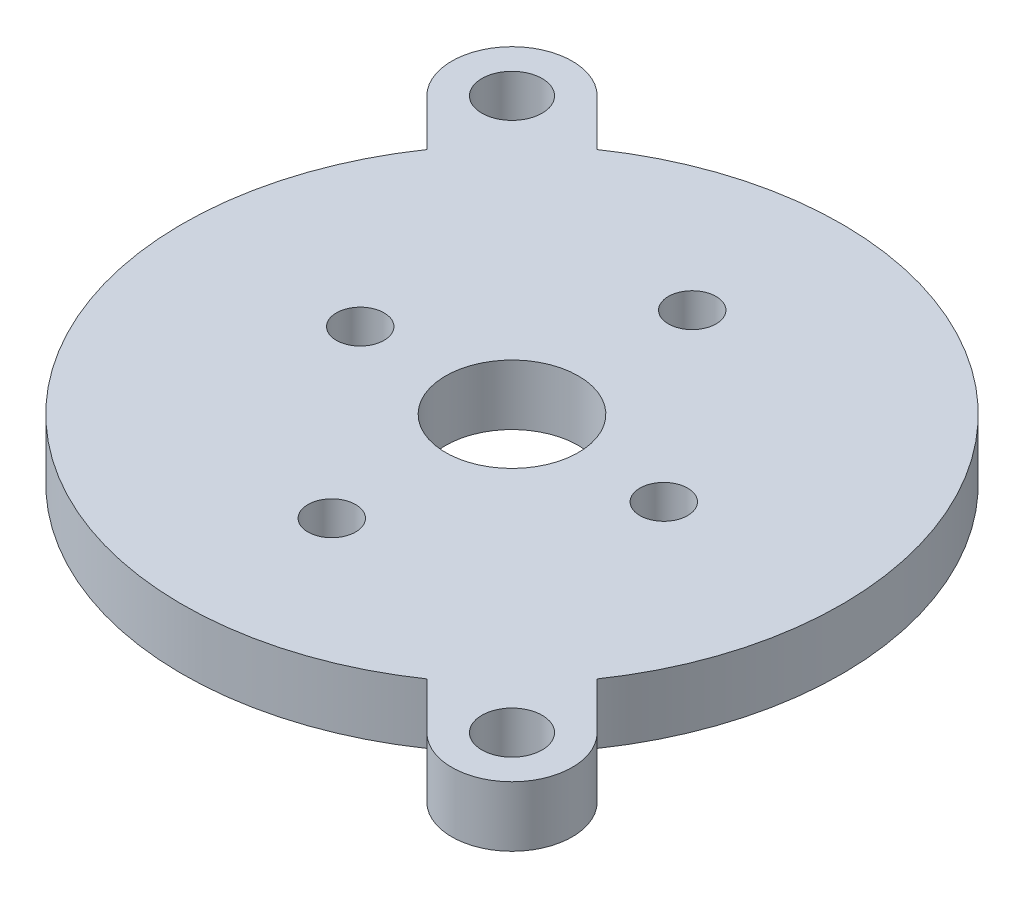
ISO-10303-21;
HEADER;
FILE_DESCRIPTION(('STEP AP214'),'2;1');
FILE_NAME('part.step','',(''),(''),'','','');
FILE_SCHEMA(('AUTOMOTIVE_DESIGN { 1 0 10303 214 1 1 1 1 }'));
ENDSEC;
DATA;
#1=APPLICATION_CONTEXT('core data for automotive mechanical design processes');
#2=APPLICATION_PROTOCOL_DEFINITION('international standard','automotive_design',2000,#1);
#3=PRODUCT_CONTEXT('',#1,'mechanical');
#4=PRODUCT('Part','Part','',(#3));
#5=PRODUCT_RELATED_PRODUCT_CATEGORY('part','',(#4));
#6=PRODUCT_DEFINITION_FORMATION('','',#4);
#7=PRODUCT_DEFINITION_CONTEXT('part definition',#1,'design');
#8=PRODUCT_DEFINITION('design','',#6,#7);
#9=PRODUCT_DEFINITION_SHAPE('','',#8);
#10=(LENGTH_UNIT() NAMED_UNIT(*) SI_UNIT(.MILLI.,.METRE.));
#11=(NAMED_UNIT(*) PLANE_ANGLE_UNIT() SI_UNIT($,.RADIAN.));
#12=(NAMED_UNIT(*) SI_UNIT($,.STERADIAN.) SOLID_ANGLE_UNIT());
#13=UNCERTAINTY_MEASURE_WITH_UNIT(LENGTH_MEASURE(1.E-05),#10,'distance_accuracy_value','');
#14=(GEOMETRIC_REPRESENTATION_CONTEXT(3) GLOBAL_UNCERTAINTY_ASSIGNED_CONTEXT((#13)) GLOBAL_UNIT_ASSIGNED_CONTEXT((#10,
#11,#12)) REPRESENTATION_CONTEXT('',''));
#15=CARTESIAN_POINT('',(0.,0.,0.));
#16=DIRECTION('',(0.,0.,1.));
#17=DIRECTION('',(1.,0.,0.));
#18=AXIS2_PLACEMENT_3D('',#15,#16,#17);
#19=CARTESIAN_POINT('',(0.,0.,0.));
#20=DIRECTION('',(0.,-1.,0.));
#21=DIRECTION('',(0.,0.,-1.));
#22=AXIS2_PLACEMENT_3D('',#19,#20,#21);
#23=CYLINDRICAL_SURFACE('',#22,17.3789975);
#24=DIRECTION('',(0.,-1.,0.));
#25=VECTOR('',#24,1.);
#26=CARTESIAN_POINT('',(14.3270532933242,3.175,9.83692523277755));
#27=LINE('',#26,#25);
#28=CARTESIAN_POINT('',(14.3270532933242,3.175,9.83692523277755));
#29=VERTEX_POINT('',#28);
#30=CARTESIAN_POINT('',(14.3270532933242,0.,9.83692523277755));
#31=VERTEX_POINT('',#30);
#32=EDGE_CURVE('E107',#29,#31,#27,.T.);
#33=ORIENTED_EDGE('',*,*,#32,.T.);
#34=CARTESIAN_POINT('',(0.,0.,0.));
#35=DIRECTION('',(0.,-1.,0.));
#36=DIRECTION('',(0.,0.,-1.));
#37=AXIS2_PLACEMENT_3D('',#34,#35,#36);
#38=CIRCLE('',#37,17.3789975);
#39=CARTESIAN_POINT('',(-9.83692523278474,0.,-14.3270532933192));
#40=VERTEX_POINT('',#39);
#41=EDGE_CURVE('E186',#40,#31,#38,.T.);
#42=ORIENTED_EDGE('',*,*,#41,.F.);
#43=DIRECTION('',(0.,-1.,0.));
#44=VECTOR('',#43,1.);
#45=CARTESIAN_POINT('',(-9.83692523278474,3.175,-14.3270532933192));
#46=LINE('',#45,#44);
#47=CARTESIAN_POINT('',(-9.83692523278474,3.175,-14.3270532933192));
#48=VERTEX_POINT('',#47);
#49=EDGE_CURVE('E156',#48,#40,#46,.T.);
#50=ORIENTED_EDGE('',*,*,#49,.F.);
#51=CARTESIAN_POINT('',(0.,3.175,0.));
#52=DIRECTION('',(0.,-1.,0.));
#53=DIRECTION('',(0.,0.,-1.));
#54=AXIS2_PLACEMENT_3D('',#51,#52,#53);
#55=CIRCLE('',#54,17.3789975);
#56=EDGE_CURVE('E183',#48,#29,#55,.T.);
#57=ORIENTED_EDGE('',*,*,#56,.T.);
#58=EDGE_LOOP('',(#33,#42,#50,#57));
#59=FACE_BOUND('',#58,.T.);
#60=ADVANCED_FACE('F34',(#59),#23,.T.);
#61=CARTESIAN_POINT('',(9.83692523279593,0.,14.3270532933115));
#62=VERTEX_POINT('',#61);
#63=CARTESIAN_POINT('',(-14.3270532933104,0.,-9.83692523279752));
#64=VERTEX_POINT('',#63);
#65=EDGE_CURVE('E185',#62,#64,#38,.T.);
#66=ORIENTED_EDGE('',*,*,#65,.F.);
#67=DIRECTION('',(0.,-1.,0.));
#68=VECTOR('',#67,1.);
#69=CARTESIAN_POINT('',(9.83692523279593,3.175,14.3270532933115));
#70=LINE('',#69,#68);
#71=CARTESIAN_POINT('',(9.83692523279593,3.175,14.3270532933115));
#72=VERTEX_POINT('',#71);
#73=EDGE_CURVE('E126',#72,#62,#70,.T.);
#74=ORIENTED_EDGE('',*,*,#73,.F.);
#75=CARTESIAN_POINT('',(-14.3270532933104,3.175,-9.83692523279752));
#76=VERTEX_POINT('',#75);
#77=EDGE_CURVE('E180',#72,#76,#55,.T.);
#78=ORIENTED_EDGE('',*,*,#77,.T.);
#79=DIRECTION('',(0.,-1.,0.));
#80=VECTOR('',#79,1.);
#81=CARTESIAN_POINT('',(-14.3270532933104,3.175,-9.83692523279752));
#82=LINE('',#81,#80);
#83=EDGE_CURVE('E140',#76,#64,#82,.T.);
#84=ORIENTED_EDGE('',*,*,#83,.T.);
#85=EDGE_LOOP('',(#66,#74,#78,#84));
#86=FACE_BOUND('',#85,.T.);
#87=ADVANCED_FACE('F218',(#86),#23,.T.);
#88=CARTESIAN_POINT('',(0.,3.175,0.));
#89=DIRECTION('',(0.,-1.,0.));
#90=DIRECTION('',(0.,0.,-1.));
#91=AXIS2_PLACEMENT_3D('',#88,#89,#90);
#92=PLANE('',#91);
#93=CARTESIAN_POINT('',(0.,3.175,-9.5));
#94=DIRECTION('',(0.,1.,0.));
#95=DIRECTION('',(0.,0.,1.));
#96=AXIS2_PLACEMENT_3D('',#93,#94,#95);
#97=CIRCLE('',#96,1.2573);
#98=CARTESIAN_POINT('',(0.,3.175,-8.2427));
#99=VERTEX_POINT('',#98);
#100=EDGE_CURVE('E163',#99,#99,#97,.T.);
#101=ORIENTED_EDGE('',*,*,#100,.F.);
#102=EDGE_LOOP('',(#101));
#103=FACE_BOUND('',#102,.T.);
#104=CARTESIAN_POINT('',(0.,3.175,9.5));
#105=DIRECTION('',(0.,1.,0.));
#106=DIRECTION('',(0.,0.,1.));
#107=AXIS2_PLACEMENT_3D('',#104,#105,#106);
#108=CIRCLE('',#107,1.2573);
#109=CARTESIAN_POINT('',(0.,3.175,10.7573));
#110=VERTEX_POINT('',#109);
#111=EDGE_CURVE('E169',#110,#110,#108,.T.);
#112=ORIENTED_EDGE('',*,*,#111,.F.);
#113=EDGE_LOOP('',(#112));
#114=FACE_BOUND('',#113,.T.);
#115=CARTESIAN_POINT('',(8.000000002,3.175,0.));
#116=DIRECTION('',(0.,1.,0.));
#117=DIRECTION('',(0.,0.,1.));
#118=AXIS2_PLACEMENT_3D('',#115,#116,#117);
#119=CIRCLE('',#118,1.2573);
#120=CARTESIAN_POINT('',(8.000000002,3.175,1.2573));
#121=VERTEX_POINT('',#120);
#122=EDGE_CURVE('E158',#121,#121,#119,.T.);
#123=ORIENTED_EDGE('',*,*,#122,.F.);
#124=EDGE_LOOP('',(#123));
#125=FACE_BOUND('',#124,.T.);
#126=CARTESIAN_POINT('',(-8.000000002,3.175,0.));
#127=DIRECTION('',(0.,1.,0.));
#128=DIRECTION('',(0.,0.,1.));
#129=AXIS2_PLACEMENT_3D('',#126,#127,#128);
#130=CIRCLE('',#129,1.2573);
#131=CARTESIAN_POINT('',(-8.000000002,3.175,1.2573));
#132=VERTEX_POINT('',#131);
#133=EDGE_CURVE('E162',#132,#132,#130,.T.);
#134=ORIENTED_EDGE('',*,*,#133,.F.);
#135=EDGE_LOOP('',(#134));
#136=FACE_BOUND('',#135,.T.);
#137=ORIENTED_EDGE('',*,*,#56,.F.);
#138=DIRECTION('',(-0.707106781186796,0.,-0.707106781186299));
#139=VECTOR('',#138,1.);
#140=CARTESIAN_POINT('',(2.24506403027069,3.175,-2.24506403027226));
#141=LINE('',#140,#139);
#142=CARTESIAN_POINT('',(-12.2888069824842,3.175,-16.7789350429985));
#143=VERTEX_POINT('',#142);
#144=EDGE_CURVE('E130',#48,#143,#141,.T.);
#145=ORIENTED_EDGE('',*,*,#144,.T.);
#146=CARTESIAN_POINT('',(-14.5338710127414,3.175,-14.5338710127413));
#147=DIRECTION('',(0.,1.,0.));
#148=DIRECTION('',(0.,0.,1.));
#149=AXIS2_PLACEMENT_3D('',#146,#147,#148);
#150=CIRCLE('',#149,3.17499999997279);
#151=CARTESIAN_POINT('',(-16.7789350429936,3.175,-12.288806982489));
#152=VERTEX_POINT('',#151);
#153=EDGE_CURVE('E132',#143,#152,#150,.T.);
#154=ORIENTED_EDGE('',*,*,#153,.T.);
#155=DIRECTION('',(-0.707106781186552,0.,-0.707106781186543));
#156=VECTOR('',#155,1.);
#157=CARTESIAN_POINT('',(-2.24506403025638,3.175,2.2450640302564));
#158=LINE('',#157,#156);
#159=EDGE_CURVE('E135',#76,#152,#158,.T.);
#160=ORIENTED_EDGE('',*,*,#159,.F.);
#161=ORIENTED_EDGE('',*,*,#77,.F.);
#162=DIRECTION('',(-0.707106781186974,0.,-0.707106781186121));
#163=VECTOR('',#162,1.);
#164=CARTESIAN_POINT('',(-2.24506403026373,3.175,2.24506403026644));
#165=LINE('',#164,#163);
#166=CARTESIAN_POINT('',(12.2888069824804,3.175,16.7789350429989));
#167=VERTEX_POINT('',#166);
#168=EDGE_CURVE('E111',#167,#72,#165,.T.);
#169=ORIENTED_EDGE('',*,*,#168,.F.);
#170=CARTESIAN_POINT('',(14.5338710127414,3.175,14.5338710127413));
#171=DIRECTION('',(0.,1.,0.));
#172=DIRECTION('',(0.,0.,1.));
#173=AXIS2_PLACEMENT_3D('',#170,#171,#172);
#174=CIRCLE('',#173,3.17499999999288);
#175=CARTESIAN_POINT('',(16.7789350430107,3.175,12.2888069824717));
#176=VERTEX_POINT('',#175);
#177=EDGE_CURVE('E112',#167,#176,#174,.T.);
#178=ORIENTED_EDGE('',*,*,#177,.T.);
#179=DIRECTION('',(-0.707106781187493,0.,-0.707106781185602));
#180=VECTOR('',#179,1.);
#181=CARTESIAN_POINT('',(2.24506403025415,3.175,-2.24506403026015));
#182=LINE('',#181,#180);
#183=EDGE_CURVE('E100',#176,#29,#182,.T.);
#184=ORIENTED_EDGE('',*,*,#183,.T.);
#185=EDGE_LOOP('',(#137,#145,#154,#160,#161,#169,#178,#184));
#186=FACE_BOUND('',#185,.T.);
#187=CARTESIAN_POINT('',(0.,3.175,0.));
#188=DIRECTION('',(0.,-1.,0.));
#189=DIRECTION('',(0.,0.,-1.));
#190=AXIS2_PLACEMENT_3D('',#187,#188,#189);
#191=CIRCLE('',#190,3.5);
#192=CARTESIAN_POINT('',(0.,3.175,-3.5));
#193=VERTEX_POINT('',#192);
#194=EDGE_CURVE('E11',#193,#193,#191,.T.);
#195=ORIENTED_EDGE('',*,*,#194,.T.);
#196=EDGE_LOOP('',(#195));
#197=FACE_BOUND('',#196,.T.);
#198=CARTESIAN_POINT('',(-14.5338710127414,3.175,-14.5338710127413));
#199=DIRECTION('',(0.,1.,0.));
#200=DIRECTION('',(0.,0.,1.));
#201=AXIS2_PLACEMENT_3D('',#198,#199,#200);
#202=CIRCLE('',#201,1.5875);
#203=CARTESIAN_POINT('',(-14.5338710127414,3.175,-12.9463710127413));
#204=VERTEX_POINT('',#203);
#205=EDGE_CURVE('E138',#204,#204,#202,.T.);
#206=ORIENTED_EDGE('',*,*,#205,.F.);
#207=EDGE_LOOP('',(#206));
#208=FACE_BOUND('',#207,.T.);
#209=CARTESIAN_POINT('',(14.5338710127414,3.175,14.5338710127413));
#210=DIRECTION('',(0.,1.,0.));
#211=DIRECTION('',(0.,0.,1.));
#212=AXIS2_PLACEMENT_3D('',#209,#210,#211);
#213=CIRCLE('',#212,1.5875);
#214=CARTESIAN_POINT('',(14.5338710127414,3.175,16.1213710127413));
#215=VERTEX_POINT('',#214);
#216=EDGE_CURVE('E119',#215,#215,#213,.T.);
#217=ORIENTED_EDGE('',*,*,#216,.F.);
#218=EDGE_LOOP('',(#217));
#219=FACE_BOUND('',#218,.T.);
#220=ADVANCED_FACE('F36',(#103,#114,#125,#136,#186,#197,#208,#219),#92,.F.);
#221=CARTESIAN_POINT('',(0.,0.,0.));
#222=DIRECTION('',(0.,-1.,0.));
#223=DIRECTION('',(0.,0.,-1.));
#224=AXIS2_PLACEMENT_3D('',#221,#222,#223);
#225=CYLINDRICAL_SURFACE('',#224,3.5);
#226=ORIENTED_EDGE('',*,*,#194,.F.);
#227=EDGE_LOOP('',(#226));
#228=FACE_BOUND('',#227,.T.);
#229=CARTESIAN_POINT('',(0.,0.,0.));
#230=DIRECTION('',(0.,-1.,0.));
#231=DIRECTION('',(0.,0.,-1.));
#232=AXIS2_PLACEMENT_3D('',#229,#230,#231);
#233=CIRCLE('',#232,3.5);
#234=CARTESIAN_POINT('',(0.,0.,-3.5));
#235=VERTEX_POINT('',#234);
#236=EDGE_CURVE('E42',#235,#235,#233,.T.);
#237=ORIENTED_EDGE('',*,*,#236,.T.);
#238=EDGE_LOOP('',(#237));
#239=FACE_BOUND('',#238,.T.);
#240=ADVANCED_FACE('F190',(#228,#239),#225,.F.);
#241=CARTESIAN_POINT('',(0.,0.,0.));
#242=DIRECTION('',(0.,1.,0.));
#243=DIRECTION('',(0.,0.,1.));
#244=AXIS2_PLACEMENT_3D('',#241,#242,#243);
#245=PLANE('',#244);
#246=CARTESIAN_POINT('',(0.,0.,-9.5));
#247=DIRECTION('',(0.,1.,0.));
#248=DIRECTION('',(0.,0.,1.));
#249=AXIS2_PLACEMENT_3D('',#246,#247,#248);
#250=CIRCLE('',#249,1.2573);
#251=CARTESIAN_POINT('',(0.,0.,-8.2427));
#252=VERTEX_POINT('',#251);
#253=EDGE_CURVE('E159',#252,#252,#250,.T.);
#254=ORIENTED_EDGE('',*,*,#253,.T.);
#255=EDGE_LOOP('',(#254));
#256=FACE_BOUND('',#255,.T.);
#257=CARTESIAN_POINT('',(0.,0.,9.5));
#258=DIRECTION('',(0.,1.,0.));
#259=DIRECTION('',(0.,0.,1.));
#260=AXIS2_PLACEMENT_3D('',#257,#258,#259);
#261=CIRCLE('',#260,1.2573);
#262=CARTESIAN_POINT('',(0.,0.,10.7573));
#263=VERTEX_POINT('',#262);
#264=EDGE_CURVE('E166',#263,#263,#261,.T.);
#265=ORIENTED_EDGE('',*,*,#264,.T.);
#266=EDGE_LOOP('',(#265));
#267=FACE_BOUND('',#266,.T.);
#268=CARTESIAN_POINT('',(8.000000002,0.,0.));
#269=DIRECTION('',(0.,1.,0.));
#270=DIRECTION('',(0.,0.,1.));
#271=AXIS2_PLACEMENT_3D('',#268,#269,#270);
#272=CIRCLE('',#271,1.2573);
#273=CARTESIAN_POINT('',(8.000000002,0.,1.2573));
#274=VERTEX_POINT('',#273);
#275=EDGE_CURVE('E172',#274,#274,#272,.T.);
#276=ORIENTED_EDGE('',*,*,#275,.T.);
#277=EDGE_LOOP('',(#276));
#278=FACE_BOUND('',#277,.T.);
#279=CARTESIAN_POINT('',(-8.000000002,0.,0.));
#280=DIRECTION('',(0.,1.,0.));
#281=DIRECTION('',(0.,0.,1.));
#282=AXIS2_PLACEMENT_3D('',#279,#280,#281);
#283=CIRCLE('',#282,1.2573);
#284=CARTESIAN_POINT('',(-8.000000002,0.,1.2573));
#285=VERTEX_POINT('',#284);
#286=EDGE_CURVE('E177',#285,#285,#283,.T.);
#287=ORIENTED_EDGE('',*,*,#286,.T.);
#288=EDGE_LOOP('',(#287));
#289=FACE_BOUND('',#288,.T.);
#290=ORIENTED_EDGE('',*,*,#236,.F.);
#291=EDGE_LOOP('',(#290));
#292=FACE_BOUND('',#291,.T.);
#293=ORIENTED_EDGE('',*,*,#41,.T.);
#294=DIRECTION('',(-0.707106781187493,0.,-0.707106781185602));
#295=VECTOR('',#294,1.);
#296=CARTESIAN_POINT('',(2.24506403025415,0.,-2.24506403026015));
#297=LINE('',#296,#295);
#298=CARTESIAN_POINT('',(16.7789350430107,0.,12.2888069824717));
#299=VERTEX_POINT('',#298);
#300=EDGE_CURVE('E206',#299,#31,#297,.T.);
#301=ORIENTED_EDGE('',*,*,#300,.F.);
#302=CARTESIAN_POINT('',(14.5338710127414,0.,14.5338710127413));
#303=DIRECTION('',(0.,1.,0.));
#304=DIRECTION('',(0.,0.,1.));
#305=AXIS2_PLACEMENT_3D('',#302,#303,#304);
#306=CIRCLE('',#305,3.17499999999288);
#307=CARTESIAN_POINT('',(12.2888069824804,0.,16.7789350429989));
#308=VERTEX_POINT('',#307);
#309=EDGE_CURVE('E122',#308,#299,#306,.T.);
#310=ORIENTED_EDGE('',*,*,#309,.F.);
#311=DIRECTION('',(-0.707106781186974,0.,-0.707106781186121));
#312=VECTOR('',#311,1.);
#313=CARTESIAN_POINT('',(-2.24506403026373,0.,2.24506403026644));
#314=LINE('',#313,#312);
#315=EDGE_CURVE('E49',#308,#62,#314,.T.);
#316=ORIENTED_EDGE('',*,*,#315,.T.);
#317=ORIENTED_EDGE('',*,*,#65,.T.);
#318=DIRECTION('',(-0.707106781186552,0.,-0.707106781186543));
#319=VECTOR('',#318,1.);
#320=CARTESIAN_POINT('',(-2.24506403025638,0.,2.2450640302564));
#321=LINE('',#320,#319);
#322=CARTESIAN_POINT('',(-16.7789350429936,0.,-12.288806982489));
#323=VERTEX_POINT('',#322);
#324=EDGE_CURVE('E144',#64,#323,#321,.T.);
#325=ORIENTED_EDGE('',*,*,#324,.T.);
#326=CARTESIAN_POINT('',(-14.5338710127414,0.,-14.5338710127413));
#327=DIRECTION('',(0.,1.,0.));
#328=DIRECTION('',(0.,0.,1.));
#329=AXIS2_PLACEMENT_3D('',#326,#327,#328);
#330=CIRCLE('',#329,3.17499999997279);
#331=CARTESIAN_POINT('',(-12.2888069824842,0.,-16.7789350429985));
#332=VERTEX_POINT('',#331);
#333=EDGE_CURVE('E124',#332,#323,#330,.T.);
#334=ORIENTED_EDGE('',*,*,#333,.F.);
#335=DIRECTION('',(-0.707106781186796,0.,-0.707106781186299));
#336=VECTOR('',#335,1.);
#337=CARTESIAN_POINT('',(2.24506403027069,0.,-2.24506403027226));
#338=LINE('',#337,#336);
#339=EDGE_CURVE('E56',#40,#332,#338,.T.);
#340=ORIENTED_EDGE('',*,*,#339,.F.);
#341=EDGE_LOOP('',(#293,#301,#310,#316,#317,#325,#334,#340));
#342=FACE_BOUND('',#341,.T.);
#343=CARTESIAN_POINT('',(-14.5338710127414,0.,-14.5338710127413));
#344=DIRECTION('',(0.,1.,0.));
#345=DIRECTION('',(0.,0.,1.));
#346=AXIS2_PLACEMENT_3D('',#343,#344,#345);
#347=CIRCLE('',#346,1.5875);
#348=CARTESIAN_POINT('',(-14.5338710127414,0.,-12.9463710127413));
#349=VERTEX_POINT('',#348);
#350=EDGE_CURVE('E133',#349,#349,#347,.T.);
#351=ORIENTED_EDGE('',*,*,#350,.T.);
#352=EDGE_LOOP('',(#351));
#353=FACE_BOUND('',#352,.T.);
#354=CARTESIAN_POINT('',(14.5338710127414,0.,14.5338710127413));
#355=DIRECTION('',(0.,1.,0.));
#356=DIRECTION('',(0.,0.,1.));
#357=AXIS2_PLACEMENT_3D('',#354,#355,#356);
#358=CIRCLE('',#357,1.5875);
#359=CARTESIAN_POINT('',(14.5338710127414,0.,16.1213710127413));
#360=VERTEX_POINT('',#359);
#361=EDGE_CURVE('E203',#360,#360,#358,.T.);
#362=ORIENTED_EDGE('',*,*,#361,.T.);
#363=EDGE_LOOP('',(#362));
#364=FACE_BOUND('',#363,.T.);
#365=ADVANCED_FACE('F192',(#256,#267,#278,#289,#292,#342,#353,#364),#245,.F.);
#366=CARTESIAN_POINT('',(-8.000000002,0.,0.));
#367=DIRECTION('',(0.,1.,0.));
#368=DIRECTION('',(0.,0.,1.));
#369=AXIS2_PLACEMENT_3D('',#366,#367,#368);
#370=CYLINDRICAL_SURFACE('',#369,1.2573);
#371=ORIENTED_EDGE('',*,*,#286,.F.);
#372=EDGE_LOOP('',(#371));
#373=FACE_BOUND('',#372,.T.);
#374=ORIENTED_EDGE('',*,*,#133,.T.);
#375=EDGE_LOOP('',(#374));
#376=FACE_BOUND('',#375,.T.);
#377=ADVANCED_FACE('F194',(#373,#376),#370,.F.);
#378=CARTESIAN_POINT('',(8.000000002,0.,0.));
#379=DIRECTION('',(0.,1.,0.));
#380=DIRECTION('',(0.,0.,1.));
#381=AXIS2_PLACEMENT_3D('',#378,#379,#380);
#382=CYLINDRICAL_SURFACE('',#381,1.2573);
#383=ORIENTED_EDGE('',*,*,#275,.F.);
#384=EDGE_LOOP('',(#383));
#385=FACE_BOUND('',#384,.T.);
#386=ORIENTED_EDGE('',*,*,#122,.T.);
#387=EDGE_LOOP('',(#386));
#388=FACE_BOUND('',#387,.T.);
#389=ADVANCED_FACE('F281',(#385,#388),#382,.F.);
#390=CARTESIAN_POINT('',(0.,0.,9.5));
#391=DIRECTION('',(0.,1.,0.));
#392=DIRECTION('',(0.,0.,1.));
#393=AXIS2_PLACEMENT_3D('',#390,#391,#392);
#394=CYLINDRICAL_SURFACE('',#393,1.2573);
#395=ORIENTED_EDGE('',*,*,#264,.F.);
#396=EDGE_LOOP('',(#395));
#397=FACE_BOUND('',#396,.T.);
#398=ORIENTED_EDGE('',*,*,#111,.T.);
#399=EDGE_LOOP('',(#398));
#400=FACE_BOUND('',#399,.T.);
#401=ADVANCED_FACE('F278',(#397,#400),#394,.F.);
#402=CARTESIAN_POINT('',(0.,0.,-9.5));
#403=DIRECTION('',(0.,1.,0.));
#404=DIRECTION('',(0.,0.,1.));
#405=AXIS2_PLACEMENT_3D('',#402,#403,#404);
#406=CYLINDRICAL_SURFACE('',#405,1.2573);
#407=ORIENTED_EDGE('',*,*,#253,.F.);
#408=EDGE_LOOP('',(#407));
#409=FACE_BOUND('',#408,.T.);
#410=ORIENTED_EDGE('',*,*,#100,.T.);
#411=EDGE_LOOP('',(#410));
#412=FACE_BOUND('',#411,.T.);
#413=ADVANCED_FACE('F275',(#409,#412),#406,.F.);
#414=CARTESIAN_POINT('',(2.24506403027069,3.175,-2.24506403027226));
#415=DIRECTION('',(-0.707106781186299,0.,0.707106781186796));
#416=DIRECTION('',(0.707106781186796,0.,0.707106781186299));
#417=AXIS2_PLACEMENT_3D('',#414,#415,#416);
#418=PLANE('',#417);
#419=ORIENTED_EDGE('',*,*,#339,.T.);
#420=DIRECTION('',(0.,-1.,0.));
#421=VECTOR('',#420,1.);
#422=CARTESIAN_POINT('',(-12.2888069824842,3.175,-16.7789350429985));
#423=LINE('',#422,#421);
#424=EDGE_CURVE('E153',#143,#332,#423,.T.);
#425=ORIENTED_EDGE('',*,*,#424,.F.);
#426=ORIENTED_EDGE('',*,*,#144,.F.);
#427=ORIENTED_EDGE('',*,*,#49,.T.);
#428=EDGE_LOOP('',(#419,#425,#426,#427));
#429=FACE_BOUND('',#428,.T.);
#430=ADVANCED_FACE('F230',(#429),#418,.F.);
#431=CARTESIAN_POINT('',(-14.5338710127414,3.175,-14.5338710127413));
#432=DIRECTION('',(0.,-1.,0.));
#433=DIRECTION('',(0.,0.,-1.));
#434=AXIS2_PLACEMENT_3D('',#431,#432,#433);
#435=CYLINDRICAL_SURFACE('',#434,3.17499999997279);
#436=ORIENTED_EDGE('',*,*,#333,.T.);
#437=DIRECTION('',(0.,-1.,0.));
#438=VECTOR('',#437,1.);
#439=CARTESIAN_POINT('',(-16.7789350429936,3.175,-12.288806982489));
#440=LINE('',#439,#438);
#441=EDGE_CURVE('E151',#152,#323,#440,.T.);
#442=ORIENTED_EDGE('',*,*,#441,.F.);
#443=ORIENTED_EDGE('',*,*,#153,.F.);
#444=ORIENTED_EDGE('',*,*,#424,.T.);
#445=EDGE_LOOP('',(#436,#442,#443,#444));
#446=FACE_BOUND('',#445,.T.);
#447=ADVANCED_FACE('F227',(#446),#435,.T.);
#448=CARTESIAN_POINT('',(-2.24506403025638,3.175,2.2450640302564));
#449=DIRECTION('',(-0.707106781186543,0.,0.707106781186552));
#450=DIRECTION('',(0.707106781186552,0.,0.707106781186543));
#451=AXIS2_PLACEMENT_3D('',#448,#449,#450);
#452=PLANE('',#451);
#453=ORIENTED_EDGE('',*,*,#324,.F.);
#454=ORIENTED_EDGE('',*,*,#83,.F.);
#455=ORIENTED_EDGE('',*,*,#159,.T.);
#456=ORIENTED_EDGE('',*,*,#441,.T.);
#457=EDGE_LOOP('',(#453,#454,#455,#456));
#458=FACE_BOUND('',#457,.T.);
#459=ADVANCED_FACE('F222',(#458),#452,.T.);
#460=CARTESIAN_POINT('',(-14.5338710127414,3.175,-14.5338710127413));
#461=DIRECTION('',(0.,-1.,0.));
#462=DIRECTION('',(0.,0.,-1.));
#463=AXIS2_PLACEMENT_3D('',#460,#461,#462);
#464=CYLINDRICAL_SURFACE('',#463,1.5875);
#465=ORIENTED_EDGE('',*,*,#205,.T.);
#466=EDGE_LOOP('',(#465));
#467=FACE_BOUND('',#466,.T.);
#468=ORIENTED_EDGE('',*,*,#350,.F.);
#469=EDGE_LOOP('',(#468));
#470=FACE_BOUND('',#469,.T.);
#471=ADVANCED_FACE('F265',(#467,#470),#464,.F.);
#472=CARTESIAN_POINT('',(14.5338710127414,3.175,14.5338710127413));
#473=DIRECTION('',(0.,-1.,0.));
#474=DIRECTION('',(0.,0.,-1.));
#475=AXIS2_PLACEMENT_3D('',#472,#473,#474);
#476=CYLINDRICAL_SURFACE('',#475,3.17499999999288);
#477=ORIENTED_EDGE('',*,*,#309,.T.);
#478=DIRECTION('',(0.,-1.,0.));
#479=VECTOR('',#478,1.);
#480=CARTESIAN_POINT('',(16.7789350430107,3.175,12.2888069824717));
#481=LINE('',#480,#479);
#482=EDGE_CURVE('E104',#176,#299,#481,.T.);
#483=ORIENTED_EDGE('',*,*,#482,.F.);
#484=ORIENTED_EDGE('',*,*,#177,.F.);
#485=DIRECTION('',(0.,-1.,0.));
#486=VECTOR('',#485,1.);
#487=CARTESIAN_POINT('',(12.2888069824804,3.175,16.7789350429989));
#488=LINE('',#487,#486);
#489=EDGE_CURVE('E212',#167,#308,#488,.T.);
#490=ORIENTED_EDGE('',*,*,#489,.T.);
#491=EDGE_LOOP('',(#477,#483,#484,#490));
#492=FACE_BOUND('',#491,.T.);
#493=ADVANCED_FACE('F121',(#492),#476,.T.);
#494=CARTESIAN_POINT('',(2.24506403025415,3.175,-2.24506403026015));
#495=DIRECTION('',(-0.707106781185602,0.,0.707106781187492));
#496=DIRECTION('',(0.707106781187493,0.,0.707106781185602));
#497=AXIS2_PLACEMENT_3D('',#494,#495,#496);
#498=PLANE('',#497);
#499=ORIENTED_EDGE('',*,*,#300,.T.);
#500=ORIENTED_EDGE('',*,*,#32,.F.);
#501=ORIENTED_EDGE('',*,*,#183,.F.);
#502=ORIENTED_EDGE('',*,*,#482,.T.);
#503=EDGE_LOOP('',(#499,#500,#501,#502));
#504=FACE_BOUND('',#503,.T.);
#505=ADVANCED_FACE('F102',(#504),#498,.F.);
#506=CARTESIAN_POINT('',(14.5338710127414,3.175,14.5338710127413));
#507=DIRECTION('',(0.,-1.,0.));
#508=DIRECTION('',(0.,0.,-1.));
#509=AXIS2_PLACEMENT_3D('',#506,#507,#508);
#510=CYLINDRICAL_SURFACE('',#509,1.5875);
#511=ORIENTED_EDGE('',*,*,#216,.T.);
#512=EDGE_LOOP('',(#511));
#513=FACE_BOUND('',#512,.T.);
#514=ORIENTED_EDGE('',*,*,#361,.F.);
#515=EDGE_LOOP('',(#514));
#516=FACE_BOUND('',#515,.T.);
#517=ADVANCED_FACE('F254',(#513,#516),#510,.F.);
#518=CARTESIAN_POINT('',(-2.24506403026373,3.175,2.24506403026644));
#519=DIRECTION('',(-0.707106781186121,0.,0.707106781186974));
#520=DIRECTION('',(0.707106781186974,0.,0.707106781186121));
#521=AXIS2_PLACEMENT_3D('',#518,#519,#520);
#522=PLANE('',#521);
#523=ORIENTED_EDGE('',*,*,#315,.F.);
#524=ORIENTED_EDGE('',*,*,#489,.F.);
#525=ORIENTED_EDGE('',*,*,#168,.T.);
#526=ORIENTED_EDGE('',*,*,#73,.T.);
#527=EDGE_LOOP('',(#523,#524,#525,#526));
#528=FACE_BOUND('',#527,.T.);
#529=ADVANCED_FACE('F216',(#528),#522,.T.);
#530=CLOSED_SHELL('',(#60,#87,#220,#240,#365,#377,#389,#401,#413,#430,#447,#459,#471,#493,#505,
#517,#529));
#531=MANIFOLD_SOLID_BREP('B2',#530);
#532=ADVANCED_BREP_SHAPE_REPRESENTATION('',(#18,#531),#14);
#533=SHAPE_DEFINITION_REPRESENTATION(#9,#532);
ENDSEC;
END-ISO-10303-21;
